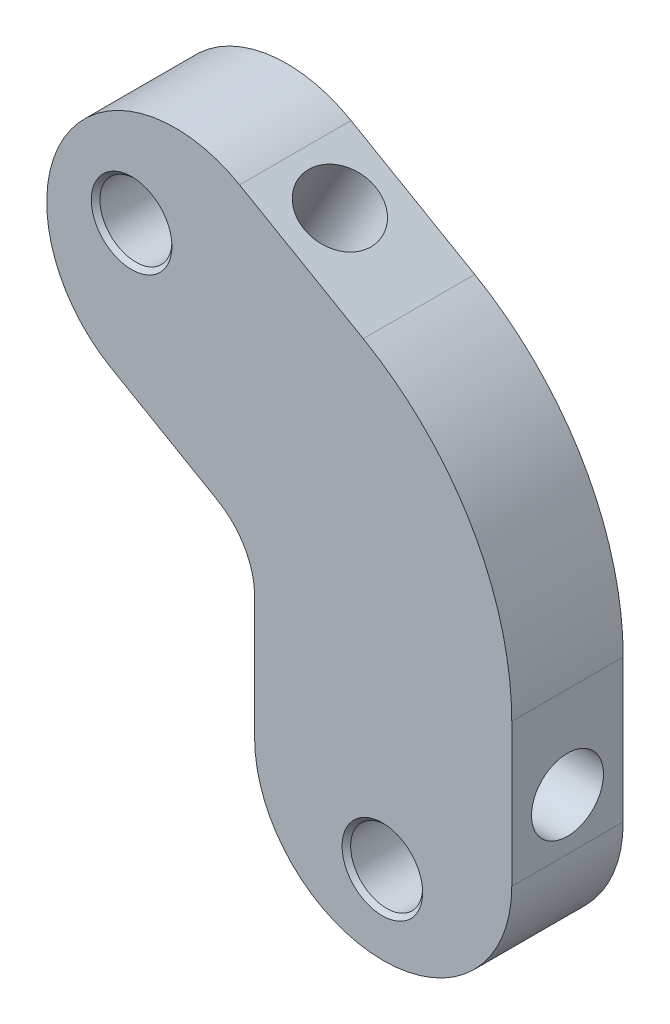
ISO-10303-21;
HEADER;
FILE_DESCRIPTION(('STEP AP214'),'2;1');
FILE_NAME('part.step','',(''),(''),'','','');
FILE_SCHEMA(('AUTOMOTIVE_DESIGN { 1 0 10303 214 1 1 1 1 }'));
ENDSEC;
DATA;
#1=APPLICATION_CONTEXT('core data for automotive mechanical design processes');
#2=APPLICATION_PROTOCOL_DEFINITION('international standard','automotive_design',2000,#1);
#3=PRODUCT_CONTEXT('',#1,'mechanical');
#4=PRODUCT('Part','Part','',(#3));
#5=PRODUCT_RELATED_PRODUCT_CATEGORY('part','',(#4));
#6=PRODUCT_DEFINITION_FORMATION('','',#4);
#7=PRODUCT_DEFINITION_CONTEXT('part definition',#1,'design');
#8=PRODUCT_DEFINITION('design','',#6,#7);
#9=PRODUCT_DEFINITION_SHAPE('','',#8);
#10=(LENGTH_UNIT() NAMED_UNIT(*) SI_UNIT(.MILLI.,.METRE.));
#11=(NAMED_UNIT(*) PLANE_ANGLE_UNIT() SI_UNIT($,.RADIAN.));
#12=(NAMED_UNIT(*) SI_UNIT($,.STERADIAN.) SOLID_ANGLE_UNIT());
#13=UNCERTAINTY_MEASURE_WITH_UNIT(LENGTH_MEASURE(1.E-05),#10,'distance_accuracy_value','');
#14=(GEOMETRIC_REPRESENTATION_CONTEXT(3) GLOBAL_UNCERTAINTY_ASSIGNED_CONTEXT((#13)) GLOBAL_UNIT_ASSIGNED_CONTEXT((#10,
#11,#12)) REPRESENTATION_CONTEXT('',''));
#15=CARTESIAN_POINT('',(0.,0.,0.));
#16=DIRECTION('',(0.,0.,1.));
#17=DIRECTION('',(1.,0.,0.));
#18=AXIS2_PLACEMENT_3D('',#15,#16,#17);
#19=CARTESIAN_POINT('',(-19.6410166168552,-11.3397456934119,13.));
#20=DIRECTION('',(0.,0.,-1.));
#21=DIRECTION('',(-1.,0.,0.));
#22=AXIS2_PLACEMENT_3D('',#19,#20,#21);
#23=CYLINDRICAL_SURFACE('',#22,34.641016151378);
#24=CARTESIAN_POINT('',(-19.6410166168552,-11.3397456934119,0.));
#25=DIRECTION('',(0.,0.,-1.));
#26=DIRECTION('',(-1.,0.,0.));
#27=AXIS2_PLACEMENT_3D('',#24,#25,#26);
#28=CIRCLE('',#27,34.641016151378);
#29=CARTESIAN_POINT('',(-2.320508541166,18.6602543065883,0.));
#30=VERTEX_POINT('',#29);
#31=CARTESIAN_POINT('',(14.999999534523,-11.3397456934118,0.));
#32=VERTEX_POINT('',#31);
#33=EDGE_CURVE('E136',#30,#32,#28,.T.);
#34=ORIENTED_EDGE('',*,*,#33,.F.);
#35=DIRECTION('',(0.,0.,-1.));
#36=VECTOR('',#35,1.);
#37=CARTESIAN_POINT('',(-2.320508541166,18.6602543065883,13.));
#38=LINE('',#37,#36);
#39=CARTESIAN_POINT('',(-2.320508541166,18.6602543065883,13.));
#40=VERTEX_POINT('',#39);
#41=EDGE_CURVE('E53',#40,#30,#38,.T.);
#42=ORIENTED_EDGE('',*,*,#41,.F.);
#43=CARTESIAN_POINT('',(-19.6410166168552,-11.3397456934119,13.));
#44=DIRECTION('',(0.,0.,-1.));
#45=DIRECTION('',(-1.,0.,0.));
#46=AXIS2_PLACEMENT_3D('',#43,#44,#45);
#47=CIRCLE('',#46,34.641016151378);
#48=CARTESIAN_POINT('',(14.999999534523,-11.3397456934118,13.));
#49=VERTEX_POINT('',#48);
#50=EDGE_CURVE('E158',#40,#49,#47,.T.);
#51=ORIENTED_EDGE('',*,*,#50,.T.);
#52=DIRECTION('',(0.,0.,-1.));
#53=VECTOR('',#52,1.);
#54=CARTESIAN_POINT('',(14.999999534523,-11.3397456934118,13.));
#55=LINE('',#54,#53);
#56=EDGE_CURVE('E93',#49,#32,#55,.T.);
#57=ORIENTED_EDGE('',*,*,#56,.T.);
#58=EDGE_LOOP('',(#34,#42,#51,#57));
#59=FACE_BOUND('',#58,.T.);
#60=ADVANCED_FACE('F36',(#59),#23,.T.);
#61=CARTESIAN_POINT('',(-16.7487113059636,26.9903810567669,13.));
#62=DIRECTION('',(0.50000000000001,0.866025403784433,0.));
#63=DIRECTION('',(-0.866025403784433,0.50000000000001,0.));
#64=AXIS2_PLACEMENT_3D('',#61,#62,#63);
#65=PLANE('',#64);
#66=CARTESIAN_POINT('',(-11.5525588832571,23.9903810567668,6.5));
#67=DIRECTION('',(0.50000000000001,0.866025403784433,0.));
#68=DIRECTION('',(-0.866025403784433,0.50000000000001,0.));
#69=AXIS2_PLACEMENT_3D('',#66,#67,#68);
#70=CIRCLE('',#69,4.20000000000004);
#71=CARTESIAN_POINT('',(-7.91525218736241,21.8903810567668,6.5));
#72=VERTEX_POINT('',#71);
#73=EDGE_CURVE('E140',#72,#72,#70,.T.);
#74=ORIENTED_EDGE('',*,*,#73,.F.);
#75=EDGE_LOOP('',(#74));
#76=FACE_BOUND('',#75,.T.);
#77=DIRECTION('',(0.866025403784433,-0.50000000000001,0.));
#78=VECTOR('',#77,1.);
#79=CARTESIAN_POINT('',(-16.7487113059636,26.9903810567669,0.));
#80=LINE('',#79,#78);
#81=CARTESIAN_POINT('',(-16.7487113059636,26.9903810567669,0.));
#82=VERTEX_POINT('',#81);
#83=EDGE_CURVE('E155',#82,#30,#80,.T.);
#84=ORIENTED_EDGE('',*,*,#83,.F.);
#85=DIRECTION('',(0.,0.,-1.));
#86=VECTOR('',#85,1.);
#87=CARTESIAN_POINT('',(-16.7487113059636,26.9903810567669,13.));
#88=LINE('',#87,#86);
#89=CARTESIAN_POINT('',(-16.7487113059636,26.9903810567669,13.));
#90=VERTEX_POINT('',#89);
#91=EDGE_CURVE('E81',#90,#82,#88,.T.);
#92=ORIENTED_EDGE('',*,*,#91,.F.);
#93=DIRECTION('',(0.866025403784433,-0.50000000000001,0.));
#94=VECTOR('',#93,1.);
#95=CARTESIAN_POINT('',(-16.7487113059636,26.9903810567669,13.));
#96=LINE('',#95,#94);
#97=EDGE_CURVE('E126',#90,#40,#96,.T.);
#98=ORIENTED_EDGE('',*,*,#97,.T.);
#99=ORIENTED_EDGE('',*,*,#41,.T.);
#100=EDGE_LOOP('',(#84,#92,#98,#99));
#101=FACE_BOUND('',#100,.T.);
#102=ADVANCED_FACE('F200',(#76,#101),#65,.T.);
#103=CARTESIAN_POINT('',(-24.2487113059643,14.,13.));
#104=DIRECTION('',(0.,0.,-1.));
#105=DIRECTION('',(-1.,0.,0.));
#106=AXIS2_PLACEMENT_3D('',#103,#104,#105);
#107=CYLINDRICAL_SURFACE('',#106,15.0000000000002);
#108=CARTESIAN_POINT('',(-24.2487113059643,14.,0.));
#109=DIRECTION('',(0.,0.,-1.));
#110=DIRECTION('',(-1.,0.,0.));
#111=AXIS2_PLACEMENT_3D('',#108,#109,#110);
#112=CIRCLE('',#111,15.0000000000002);
#113=CARTESIAN_POINT('',(-31.7487113059639,1.00961894323333,0.));
#114=VERTEX_POINT('',#113);
#115=EDGE_CURVE('E112',#114,#82,#112,.T.);
#116=ORIENTED_EDGE('',*,*,#115,.F.);
#117=DIRECTION('',(0.,0.,-1.));
#118=VECTOR('',#117,1.);
#119=CARTESIAN_POINT('',(-31.7487113059639,1.00961894323333,13.));
#120=LINE('',#119,#118);
#121=CARTESIAN_POINT('',(-31.7487113059639,1.00961894323333,13.));
#122=VERTEX_POINT('',#121);
#123=EDGE_CURVE('E108',#122,#114,#120,.T.);
#124=ORIENTED_EDGE('',*,*,#123,.F.);
#125=CARTESIAN_POINT('',(-24.2487113059643,14.,13.));
#126=DIRECTION('',(0.,0.,-1.));
#127=DIRECTION('',(-1.,0.,0.));
#128=AXIS2_PLACEMENT_3D('',#125,#126,#127);
#129=CIRCLE('',#128,14.9999999999998);
#130=EDGE_CURVE('E111',#122,#90,#129,.T.);
#131=ORIENTED_EDGE('',*,*,#130,.T.);
#132=ORIENTED_EDGE('',*,*,#91,.T.);
#133=EDGE_LOOP('',(#116,#124,#131,#132));
#134=FACE_BOUND('',#133,.T.);
#135=ADVANCED_FACE('F110',(#134),#107,.T.);
#136=CARTESIAN_POINT('',(-19.3301274843993,-6.16025376910026,13.));
#137=DIRECTION('',(-0.499999999999976,-0.866025403784452,0.));
#138=DIRECTION('',(0.866025403784453,-0.499999999999976,0.));
#139=AXIS2_PLACEMENT_3D('',#136,#137,#138);
#140=PLANE('',#139);
#141=CARTESIAN_POINT('',(-26.5525588832568,-1.99038105676587,6.5));
#142=DIRECTION('',(-0.5,-0.866025403784439,0.));
#143=DIRECTION('',(0.866025403784439,-0.5,0.));
#144=AXIS2_PLACEMENT_3D('',#141,#142,#143);
#145=CIRCLE('',#144,4.20000000000004);
#146=CARTESIAN_POINT('',(-22.9152521873621,-4.09038105676589,6.5));
#147=VERTEX_POINT('',#146);
#148=EDGE_CURVE('E280',#147,#147,#145,.T.);
#149=ORIENTED_EDGE('',*,*,#148,.F.);
#150=EDGE_LOOP('',(#149));
#151=FACE_BOUND('',#150,.T.);
#152=DIRECTION('',(-0.866025403784453,0.499999999999976,0.));
#153=VECTOR('',#152,1.);
#154=CARTESIAN_POINT('',(-19.3301274843993,-6.16025376910026,0.));
#155=LINE('',#154,#153);
#156=CARTESIAN_POINT('',(-19.3301274843993,-6.16025376910026,0.));
#157=VERTEX_POINT('',#156);
#158=EDGE_CURVE('E152',#157,#114,#155,.T.);
#159=ORIENTED_EDGE('',*,*,#158,.F.);
#160=DIRECTION('',(0.,0.,-1.));
#161=VECTOR('',#160,1.);
#162=CARTESIAN_POINT('',(-19.3301274843993,-6.16025376910026,13.));
#163=LINE('',#162,#161);
#164=CARTESIAN_POINT('',(-19.3301274843993,-6.16025376910026,13.));
#165=VERTEX_POINT('',#164);
#166=EDGE_CURVE('E117',#165,#157,#163,.T.);
#167=ORIENTED_EDGE('',*,*,#166,.F.);
#168=DIRECTION('',(-0.866025403784453,0.499999999999976,0.));
#169=VECTOR('',#168,1.);
#170=CARTESIAN_POINT('',(-19.3301274843993,-6.16025376910026,13.));
#171=LINE('',#170,#169);
#172=EDGE_CURVE('E124',#165,#122,#171,.T.);
#173=ORIENTED_EDGE('',*,*,#172,.T.);
#174=ORIENTED_EDGE('',*,*,#123,.T.);
#175=EDGE_LOOP('',(#159,#167,#173,#174));
#176=FACE_BOUND('',#175,.T.);
#177=ADVANCED_FACE('F128',(#151,#176),#140,.T.);
#178=CARTESIAN_POINT('',(-23.6602545033221,-13.6602537691008,13.));
#179=DIRECTION('',(0.,0.,-1.));
#180=DIRECTION('',(-1.,0.,0.));
#181=AXIS2_PLACEMENT_3D('',#178,#179,#180);
#182=CYLINDRICAL_SURFACE('',#181,8.66025403784512);
#183=CARTESIAN_POINT('',(-23.6602545033221,-13.6602537691008,0.));
#184=DIRECTION('',(0.,0.,1.));
#185=DIRECTION('',(1.,0.,0.));
#186=AXIS2_PLACEMENT_3D('',#183,#184,#185);
#187=CIRCLE('',#186,8.66025403784512);
#188=CARTESIAN_POINT('',(-15.000000465477,-13.6602537691003,0.));
#189=VERTEX_POINT('',#188);
#190=EDGE_CURVE('E149',#189,#157,#187,.T.);
#191=ORIENTED_EDGE('',*,*,#190,.F.);
#192=DIRECTION('',(0.,0.,-1.));
#193=VECTOR('',#192,1.);
#194=CARTESIAN_POINT('',(-15.000000465477,-13.6602537691003,13.));
#195=LINE('',#194,#193);
#196=CARTESIAN_POINT('',(-15.000000465477,-13.6602537691003,13.));
#197=VERTEX_POINT('',#196);
#198=EDGE_CURVE('E163',#197,#189,#195,.T.);
#199=ORIENTED_EDGE('',*,*,#198,.F.);
#200=CARTESIAN_POINT('',(-23.6602545033221,-13.6602537691008,13.));
#201=DIRECTION('',(0.,0.,1.));
#202=DIRECTION('',(1.,0.,0.));
#203=AXIS2_PLACEMENT_3D('',#200,#201,#202);
#204=CIRCLE('',#203,8.66025403784512);
#205=EDGE_CURVE('E129',#197,#165,#204,.T.);
#206=ORIENTED_EDGE('',*,*,#205,.T.);
#207=ORIENTED_EDGE('',*,*,#166,.T.);
#208=EDGE_LOOP('',(#191,#199,#206,#207));
#209=FACE_BOUND('',#208,.T.);
#210=ADVANCED_FACE('F251',(#209),#182,.F.);
#211=CARTESIAN_POINT('',(-15.0000004654777,-27.9999997312565,13.));
#212=DIRECTION('',(-1.,0.,0.));
#213=DIRECTION('',(0.,-1.,0.));
#214=AXIS2_PLACEMENT_3D('',#211,#212,#213);
#215=PLANE('',#214);
#216=CARTESIAN_POINT('',(-15.0000004654764,-21.9999999999993,6.5));
#217=DIRECTION('',(-1.,0.,0.));
#218=DIRECTION('',(0.,-1.,0.));
#219=AXIS2_PLACEMENT_3D('',#216,#217,#218);
#220=CIRCLE('',#219,4.19999999999998);
#221=CARTESIAN_POINT('',(-15.0000004654764,-26.1999999999993,6.5));
#222=VERTEX_POINT('',#221);
#223=EDGE_CURVE('E284',#222,#222,#220,.T.);
#224=ORIENTED_EDGE('',*,*,#223,.F.);
#225=EDGE_LOOP('',(#224));
#226=FACE_BOUND('',#225,.T.);
#227=DIRECTION('',(0.,1.,0.));
#228=VECTOR('',#227,1.);
#229=CARTESIAN_POINT('',(-15.0000004654777,-27.9999997312565,0.));
#230=LINE('',#229,#228);
#231=CARTESIAN_POINT('',(-15.0000004654777,-27.9999997312565,0.));
#232=VERTEX_POINT('',#231);
#233=EDGE_CURVE('E146',#232,#189,#230,.T.);
#234=ORIENTED_EDGE('',*,*,#233,.F.);
#235=DIRECTION('',(0.,0.,-1.));
#236=VECTOR('',#235,1.);
#237=CARTESIAN_POINT('',(-15.0000004654777,-27.9999997312565,13.));
#238=LINE('',#237,#236);
#239=CARTESIAN_POINT('',(-15.0000004654777,-27.9999997312565,13.));
#240=VERTEX_POINT('',#239);
#241=EDGE_CURVE('E165',#240,#232,#238,.T.);
#242=ORIENTED_EDGE('',*,*,#241,.F.);
#243=DIRECTION('',(0.,1.,0.));
#244=VECTOR('',#243,1.);
#245=CARTESIAN_POINT('',(-15.0000004654777,-27.9999997312565,13.));
#246=LINE('',#245,#244);
#247=EDGE_CURVE('E131',#240,#197,#246,.T.);
#248=ORIENTED_EDGE('',*,*,#247,.T.);
#249=ORIENTED_EDGE('',*,*,#198,.T.);
#250=EDGE_LOOP('',(#234,#242,#248,#249));
#251=FACE_BOUND('',#250,.T.);
#252=ADVANCED_FACE('F255',(#226,#251),#215,.T.);
#253=CARTESIAN_POINT('',(-4.65477687807613E-07,-27.9999997312565,13.));
#254=DIRECTION('',(0.,0.,-1.));
#255=DIRECTION('',(-1.,0.,0.));
#256=AXIS2_PLACEMENT_3D('',#253,#254,#255);
#257=CYLINDRICAL_SURFACE('',#256,15.);
#258=CARTESIAN_POINT('',(-4.65477687807613E-07,-27.9999997312565,0.));
#259=DIRECTION('',(0.,0.,-1.));
#260=DIRECTION('',(-1.,0.,0.));
#261=AXIS2_PLACEMENT_3D('',#258,#259,#260);
#262=CIRCLE('',#261,15.);
#263=CARTESIAN_POINT('',(14.9999995345223,-27.9999997312565,0.));
#264=VERTEX_POINT('',#263);
#265=EDGE_CURVE('E143',#264,#232,#262,.T.);
#266=ORIENTED_EDGE('',*,*,#265,.F.);
#267=DIRECTION('',(0.,0.,-1.));
#268=VECTOR('',#267,1.);
#269=CARTESIAN_POINT('',(14.9999995345223,-27.9999997312565,13.));
#270=LINE('',#269,#268);
#271=CARTESIAN_POINT('',(14.9999995345223,-27.9999997312565,13.));
#272=VERTEX_POINT('',#271);
#273=EDGE_CURVE('E167',#272,#264,#270,.T.);
#274=ORIENTED_EDGE('',*,*,#273,.F.);
#275=CARTESIAN_POINT('',(-4.65477687807613E-07,-27.9999997312565,13.));
#276=DIRECTION('',(0.,0.,-1.));
#277=DIRECTION('',(-1.,0.,0.));
#278=AXIS2_PLACEMENT_3D('',#275,#276,#277);
#279=CIRCLE('',#278,15.);
#280=EDGE_CURVE('E269',#272,#240,#279,.T.);
#281=ORIENTED_EDGE('',*,*,#280,.T.);
#282=ORIENTED_EDGE('',*,*,#241,.T.);
#283=EDGE_LOOP('',(#266,#274,#281,#282));
#284=FACE_BOUND('',#283,.T.);
#285=ADVANCED_FACE('F242',(#284),#257,.T.);
#286=CARTESIAN_POINT('',(14.999999534523,-11.3397456934118,13.));
#287=DIRECTION('',(1.,0.,0.));
#288=DIRECTION('',(0.,1.,0.));
#289=AXIS2_PLACEMENT_3D('',#286,#287,#288);
#290=PLANE('',#289);
#291=CARTESIAN_POINT('',(14.999999534523,-21.9999999999993,6.5));
#292=DIRECTION('',(-1.,0.,0.));
#293=DIRECTION('',(0.,-1.,0.));
#294=AXIS2_PLACEMENT_3D('',#291,#292,#293);
#295=CIRCLE('',#294,4.19999999999998);
#296=CARTESIAN_POINT('',(14.999999534523,-26.1999999999993,6.5));
#297=VERTEX_POINT('',#296);
#298=EDGE_CURVE('E283',#297,#297,#295,.T.);
#299=ORIENTED_EDGE('',*,*,#298,.T.);
#300=EDGE_LOOP('',(#299));
#301=FACE_BOUND('',#300,.T.);
#302=DIRECTION('',(0.,-1.,0.));
#303=VECTOR('',#302,1.);
#304=CARTESIAN_POINT('',(14.999999534523,-11.3397456934118,0.));
#305=LINE('',#304,#303);
#306=EDGE_CURVE('E139',#32,#264,#305,.T.);
#307=ORIENTED_EDGE('',*,*,#306,.F.);
#308=ORIENTED_EDGE('',*,*,#56,.F.);
#309=DIRECTION('',(0.,-1.,0.));
#310=VECTOR('',#309,1.);
#311=CARTESIAN_POINT('',(14.999999534523,-11.3397456934118,13.));
#312=LINE('',#311,#310);
#313=EDGE_CURVE('E268',#49,#272,#312,.T.);
#314=ORIENTED_EDGE('',*,*,#313,.T.);
#315=ORIENTED_EDGE('',*,*,#273,.T.);
#316=EDGE_LOOP('',(#307,#308,#314,#315));
#317=FACE_BOUND('',#316,.T.);
#318=ADVANCED_FACE('F209',(#301,#317),#290,.T.);
#319=CARTESIAN_POINT('',(-19.6410166168552,-11.3397456934119,13.));
#320=DIRECTION('',(0.,0.,-1.));
#321=DIRECTION('',(-1.,0.,0.));
#322=AXIS2_PLACEMENT_3D('',#319,#320,#321);
#323=PLANE('',#322);
#324=CARTESIAN_POINT('',(-29.3474320970751,16.8312434638099,13.));
#325=DIRECTION('',(0.,0.,-1.));
#326=DIRECTION('',(-1.,0.,0.));
#327=AXIS2_PLACEMENT_3D('',#324,#325,#326);
#328=CIRCLE('',#327,4.69999999999999);
#329=CARTESIAN_POINT('',(-34.0474320970751,16.8312434638099,13.));
#330=VERTEX_POINT('',#329);
#331=EDGE_CURVE('E11',#330,#330,#328,.T.);
#332=ORIENTED_EDGE('',*,*,#331,.T.);
#333=EDGE_LOOP('',(#332));
#334=FACE_BOUND('',#333,.T.);
#335=CARTESIAN_POINT('',(-0.0974320970731666,-33.8312426575786,13.));
#336=DIRECTION('',(0.,0.,-1.));
#337=DIRECTION('',(-1.,0.,0.));
#338=AXIS2_PLACEMENT_3D('',#335,#336,#337);
#339=CIRCLE('',#338,4.69999999999998);
#340=CARTESIAN_POINT('',(-4.79743209707315,-33.8312426575786,13.));
#341=VERTEX_POINT('',#340);
#342=EDGE_CURVE('E45',#341,#341,#339,.T.);
#343=ORIENTED_EDGE('',*,*,#342,.T.);
#344=EDGE_LOOP('',(#343));
#345=FACE_BOUND('',#344,.T.);
#346=ORIENTED_EDGE('',*,*,#50,.F.);
#347=ORIENTED_EDGE('',*,*,#97,.F.);
#348=ORIENTED_EDGE('',*,*,#130,.F.);
#349=ORIENTED_EDGE('',*,*,#172,.F.);
#350=ORIENTED_EDGE('',*,*,#205,.F.);
#351=ORIENTED_EDGE('',*,*,#247,.F.);
#352=ORIENTED_EDGE('',*,*,#280,.F.);
#353=ORIENTED_EDGE('',*,*,#313,.F.);
#354=EDGE_LOOP('',(#346,#347,#348,#349,#350,#351,#352,#353));
#355=FACE_BOUND('',#354,.T.);
#356=ADVANCED_FACE('F122',(#334,#345,#355),#323,.F.);
#357=CARTESIAN_POINT('',(-19.6410166168552,-11.3397456934119,0.));
#358=DIRECTION('',(0.,0.,-1.));
#359=DIRECTION('',(-1.,0.,0.));
#360=AXIS2_PLACEMENT_3D('',#357,#358,#359);
#361=PLANE('',#360);
#362=CARTESIAN_POINT('',(-0.0974320970731666,-33.8312426575786,0.));
#363=DIRECTION('',(0.,0.,-1.));
#364=DIRECTION('',(-1.,0.,0.));
#365=AXIS2_PLACEMENT_3D('',#362,#363,#364);
#366=CIRCLE('',#365,4.7);
#367=CARTESIAN_POINT('',(-4.79743209707316,-33.8312426575786,0.));
#368=VERTEX_POINT('',#367);
#369=EDGE_CURVE('E178',#368,#368,#366,.F.);
#370=ORIENTED_EDGE('',*,*,#369,.T.);
#371=EDGE_LOOP('',(#370));
#372=FACE_BOUND('',#371,.T.);
#373=CARTESIAN_POINT('',(-29.3474320970751,16.8312434638099,0.));
#374=DIRECTION('',(0.,0.,-1.));
#375=DIRECTION('',(-1.,0.,0.));
#376=AXIS2_PLACEMENT_3D('',#373,#374,#375);
#377=CIRCLE('',#376,4.7);
#378=CARTESIAN_POINT('',(-34.0474320970751,16.8312434638099,0.));
#379=VERTEX_POINT('',#378);
#380=EDGE_CURVE('E175',#379,#379,#377,.F.);
#381=ORIENTED_EDGE('',*,*,#380,.T.);
#382=EDGE_LOOP('',(#381));
#383=FACE_BOUND('',#382,.T.);
#384=ORIENTED_EDGE('',*,*,#33,.T.);
#385=ORIENTED_EDGE('',*,*,#306,.T.);
#386=ORIENTED_EDGE('',*,*,#265,.T.);
#387=ORIENTED_EDGE('',*,*,#233,.T.);
#388=ORIENTED_EDGE('',*,*,#190,.T.);
#389=ORIENTED_EDGE('',*,*,#158,.T.);
#390=ORIENTED_EDGE('',*,*,#115,.T.);
#391=ORIENTED_EDGE('',*,*,#83,.T.);
#392=EDGE_LOOP('',(#384,#385,#386,#387,#388,#389,#390,#391));
#393=FACE_BOUND('',#392,.T.);
#394=ADVANCED_FACE('F233',(#372,#383,#393),#361,.T.);
#395=CARTESIAN_POINT('',(-2.74519064475215,39.2451903268258,6.5));
#396=DIRECTION('',(-0.5,-0.866025403784439,0.));
#397=DIRECTION('',(0.866025403784439,-0.5,0.));
#398=AXIS2_PLACEMENT_3D('',#395,#396,#397);
#399=CYLINDRICAL_SURFACE('',#398,4.20000000000004);
#400=CARTESIAN_POINT('',(-7.91525218736241,21.8903810567668,6.5));
#401=CARTESIAN_POINT('',(-8.0715021873624,21.6197481180841,6.5));
#402=CARTESIAN_POINT('',(-8.2277521873624,21.3491151794015,6.5));
#403=CARTESIAN_POINT('',(-8.54025218736239,20.8078493020362,6.5));
#404=CARTESIAN_POINT('',(-8.69650218736239,20.5372163633536,6.5));
#405=CARTESIAN_POINT('',(-9.00900218736238,19.9959504859884,6.5));
#406=CARTESIAN_POINT('',(-9.16525218736238,19.7253175473057,6.5));
#407=CARTESIAN_POINT('',(-9.47775218736238,19.1840516699405,6.5));
#408=CARTESIAN_POINT('',(-9.63400218736238,18.9134187312578,6.5));
#409=CARTESIAN_POINT('',(-9.94650218736237,18.3721528538926,6.5));
#410=CARTESIAN_POINT('',(-10.1027521873624,18.1015199152099,6.5));
#411=CARTESIAN_POINT('',(-10.4152521873624,17.5602540378447,6.5));
#412=CARTESIAN_POINT('',(-10.5715021873624,17.289621099162,6.5));
#413=CARTESIAN_POINT('',(-10.8840021873623,16.7483552217968,6.5));
#414=CARTESIAN_POINT('',(-11.0402521873623,16.4777222831141,6.5));
#415=CARTESIAN_POINT('',(-11.3527521873623,15.9364564057489,6.5));
#416=CARTESIAN_POINT('',(-11.5090021873623,15.6658234670662,6.5));
#417=CARTESIAN_POINT('',(-11.8215021873623,15.124557589701,6.5));
#418=CARTESIAN_POINT('',(-11.9777521873623,14.8539246510183,6.5));
#419=CARTESIAN_POINT('',(-12.2902521873623,14.3126587736531,6.5));
#420=CARTESIAN_POINT('',(-12.4465021873623,14.0420258349704,6.5));
#421=CARTESIAN_POINT('',(-12.7590021873623,13.5007599576052,6.5));
#422=CARTESIAN_POINT('',(-12.9152521873623,13.2301270189226,6.5));
#423=CARTESIAN_POINT('',(-13.2277521873623,12.6888611415573,6.5));
#424=CARTESIAN_POINT('',(-13.3840021873623,12.4182282028747,6.5));
#425=CARTESIAN_POINT('',(-13.6965021873623,11.8769623255094,6.5));
#426=CARTESIAN_POINT('',(-13.8527521873623,11.6063293868268,6.5));
#427=CARTESIAN_POINT('',(-14.1652521873623,11.0650635094615,6.5));
#428=CARTESIAN_POINT('',(-14.3215021873623,10.7944305707789,6.5));
#429=CARTESIAN_POINT('',(-14.6340021873623,10.2531646934136,6.5));
#430=CARTESIAN_POINT('',(-14.7902521873623,9.98253175473097,6.5));
#431=CARTESIAN_POINT('',(-15.1027521873623,9.4412658773657,6.5));
#432=CARTESIAN_POINT('',(-15.2590021873623,9.17063293868307,6.5));
#433=CARTESIAN_POINT('',(-15.5715021873623,8.62936706131781,6.5));
#434=CARTESIAN_POINT('',(-15.7277521873623,8.35873412263518,6.5));
#435=CARTESIAN_POINT('',(-16.0402521873622,7.81746824526991,6.5));
#436=CARTESIAN_POINT('',(-16.1965021873622,7.54683530658728,6.5));
#437=CARTESIAN_POINT('',(-16.5090021873622,7.00556942922202,6.5));
#438=CARTESIAN_POINT('',(-16.6652521873622,6.73493649053938,6.5));
#439=CARTESIAN_POINT('',(-16.9777521873622,6.19367061317412,6.5));
#440=CARTESIAN_POINT('',(-17.1340021873622,5.92303767449149,6.5));
#441=CARTESIAN_POINT('',(-17.4465021873622,5.38177179712623,6.5));
#442=CARTESIAN_POINT('',(-17.6027521873622,5.11113885844359,6.5));
#443=CARTESIAN_POINT('',(-17.9152521873622,4.56987298107833,6.5));
#444=CARTESIAN_POINT('',(-18.0715021873622,4.2992400423957,6.5));
#445=CARTESIAN_POINT('',(-18.3840021873622,3.75797416503044,6.5));
#446=CARTESIAN_POINT('',(-18.5402521873622,3.4873412263478,6.5));
#447=CARTESIAN_POINT('',(-18.8527521873622,2.94607534898254,6.5));
#448=CARTESIAN_POINT('',(-19.0090021873622,2.67544241029991,6.5));
#449=CARTESIAN_POINT('',(-19.3215021873622,2.13417653293464,6.5));
#450=CARTESIAN_POINT('',(-19.4777521873622,1.86354359425201,6.5));
#451=CARTESIAN_POINT('',(-19.7902521873622,1.32227771688674,6.5));
#452=CARTESIAN_POINT('',(-19.9465021873622,1.05164477820411,6.5));
#453=CARTESIAN_POINT('',(-20.2590021873622,0.510378900838847,6.5));
#454=CARTESIAN_POINT('',(-20.4152521873622,0.239745962156215,6.5));
#455=CARTESIAN_POINT('',(-20.7277521873622,-0.301519915209048,6.5));
#456=CARTESIAN_POINT('',(-20.8840021873622,-0.572152853891679,6.5));
#457=CARTESIAN_POINT('',(-21.1965021873621,-1.11341873125694,6.5));
#458=CARTESIAN_POINT('',(-21.3527521873621,-1.38405166993958,6.5));
#459=CARTESIAN_POINT('',(-21.6652521873621,-1.92531754730484,6.5));
#460=CARTESIAN_POINT('',(-21.8215021873621,-2.19595048598747,6.5));
#461=CARTESIAN_POINT('',(-22.1340021873621,-2.73721636335274,6.5));
#462=CARTESIAN_POINT('',(-22.2902521873621,-3.00784930203537,6.5));
#463=CARTESIAN_POINT('',(-22.6027521873621,-3.54911517940063,6.5));
#464=CARTESIAN_POINT('',(-22.7590021873621,-3.81974811808326,6.5));
#465=CARTESIAN_POINT('',(-22.9152521873621,-4.09038105676589,6.5));
#466=B_SPLINE_CURVE_WITH_KNOTS('',3,(#400,#401,#402,#403,#404,#405,#406,#407,#408,#409,#410,
#411,#412,#413,#414,#415,#416,#417,#418,#419,#420,#421,#422,#423,#424,#425,#426,#427,#428,#429,
#430,#431,#432,#433,#434,#435,#436,#437,#438,#439,#440,#441,#442,#443,#444,#445,#446,#447,#448,
#449,#450,#451,#452,#453,#454,#455,#456,#457,#458,#459,#460,#461,#462,#463,#464,#465),
.UNSPECIFIED.,.F.,.F.,(4,2,2,2,2,2,2,2,2,2,2,2,2,2,2,2,2,2,2,2,2,2,2,2,2,2,2,2,2,2,2,2,4),(0.,
0.937499999999983,1.87499999999996,2.81249999999994,3.74999999999993,4.68749999999991,
5.62499999999989,6.56249999999987,7.49999999999986,8.43749999999984,9.37499999999982,
10.3124999999998,11.2499999999998,12.1874999999998,13.1249999999997,14.0624999999997,
14.9999999999997,15.9374999999997,16.8749999999997,17.8124999999997,18.7499999999996,
19.6874999999996,20.6249999999996,21.5624999999996,22.4999999999996,23.4374999999996,
24.3749999999995,25.3124999999995,26.2499999999995,27.1874999999995,28.1249999999995,
29.0624999999994,29.9999999999994),.UNSPECIFIED.);
#467=EDGE_CURVE('BSEAM239',#72,#147,#466,.T.);
#468=ORIENTED_EDGE('',*,*,#73,.T.);
#469=ORIENTED_EDGE('',*,*,#148,.T.);
#470=ORIENTED_EDGE('',*,*,#467,.T.);
#471=ORIENTED_EDGE('',*,*,#467,.F.);
#472=EDGE_LOOP('',(#468,#470,#469,#471));
#473=FACE_BOUND('',#472,.T.);
#474=ADVANCED_FACE('F239',(#473),#399,.F.);
#475=CARTESIAN_POINT('',(14.999999534523,-21.9999999999993,6.5));
#476=DIRECTION('',(-1.,0.,0.));
#477=DIRECTION('',(0.,-1.,0.));
#478=AXIS2_PLACEMENT_3D('',#475,#476,#477);
#479=CYLINDRICAL_SURFACE('',#478,4.19999999999998);
#480=CARTESIAN_POINT('',(-15.0000004654764,-26.1999999999993,6.5));
#481=CARTESIAN_POINT('',(-14.6875004654764,-26.1999999999993,6.5));
#482=CARTESIAN_POINT('',(-14.3750004654764,-26.1999999999993,6.5));
#483=CARTESIAN_POINT('',(-13.7500004654764,-26.1999999999993,6.5));
#484=CARTESIAN_POINT('',(-13.4375004654764,-26.1999999999993,6.5));
#485=CARTESIAN_POINT('',(-12.8125004654765,-26.1999999999993,6.5));
#486=CARTESIAN_POINT('',(-12.5000004654765,-26.1999999999993,6.5));
#487=CARTESIAN_POINT('',(-11.8750004654765,-26.1999999999993,6.5));
#488=CARTESIAN_POINT('',(-11.5625004654765,-26.1999999999993,6.5));
#489=CARTESIAN_POINT('',(-10.9375004654765,-26.1999999999993,6.5));
#490=CARTESIAN_POINT('',(-10.6250004654765,-26.1999999999993,6.5));
#491=CARTESIAN_POINT('',(-10.0000004654765,-26.1999999999993,6.5));
#492=CARTESIAN_POINT('',(-9.68750046547652,-26.1999999999993,6.5));
#493=CARTESIAN_POINT('',(-9.06250046547654,-26.1999999999993,6.5));
#494=CARTESIAN_POINT('',(-8.75000046547654,-26.1999999999993,6.5));
#495=CARTESIAN_POINT('',(-8.12500046547656,-26.1999999999993,6.5));
#496=CARTESIAN_POINT('',(-7.81250046547656,-26.1999999999993,6.5));
#497=CARTESIAN_POINT('',(-7.18750046547657,-26.1999999999993,6.5));
#498=CARTESIAN_POINT('',(-6.87500046547658,-26.1999999999993,6.5));
#499=CARTESIAN_POINT('',(-6.25000046547659,-26.1999999999993,6.5));
#500=CARTESIAN_POINT('',(-5.9375004654766,-26.1999999999993,6.5));
#501=CARTESIAN_POINT('',(-5.31250046547661,-26.1999999999993,6.5));
#502=CARTESIAN_POINT('',(-5.00000046547662,-26.1999999999993,6.5));
#503=CARTESIAN_POINT('',(-4.37500046547663,-26.1999999999993,6.5));
#504=CARTESIAN_POINT('',(-4.06250046547664,-26.1999999999993,6.5));
#505=CARTESIAN_POINT('',(-3.43750046547665,-26.1999999999993,6.5));
#506=CARTESIAN_POINT('',(-3.12500046547666,-26.1999999999993,6.5));
#507=CARTESIAN_POINT('',(-2.50000046547667,-26.1999999999993,6.5));
#508=CARTESIAN_POINT('',(-2.18750046547668,-26.1999999999993,6.5));
#509=CARTESIAN_POINT('',(-1.56250046547669,-26.1999999999993,6.5));
#510=CARTESIAN_POINT('',(-1.2500004654767,-26.1999999999993,6.5));
#511=CARTESIAN_POINT('',(-0.625000465476711,-26.1999999999993,6.5));
#512=CARTESIAN_POINT('',(-0.312500465476718,-26.1999999999993,6.5));
#513=CARTESIAN_POINT('',(0.312499534523268,-26.1999999999993,6.5));
#514=CARTESIAN_POINT('',(0.624999534523262,-26.1999999999993,6.5));
#515=CARTESIAN_POINT('',(1.24999953452325,-26.1999999999993,6.5));
#516=CARTESIAN_POINT('',(1.56249953452324,-26.1999999999993,6.5));
#517=CARTESIAN_POINT('',(2.18749953452323,-26.1999999999993,6.5));
#518=CARTESIAN_POINT('',(2.49999953452322,-26.1999999999993,6.5));
#519=CARTESIAN_POINT('',(3.12499953452321,-26.1999999999993,6.5));
#520=CARTESIAN_POINT('',(3.43749953452321,-26.1999999999993,6.5));
#521=CARTESIAN_POINT('',(4.06249953452319,-26.1999999999993,6.5));
#522=CARTESIAN_POINT('',(4.37499953452319,-26.1999999999993,6.5));
#523=CARTESIAN_POINT('',(4.99999953452317,-26.1999999999993,6.5));
#524=CARTESIAN_POINT('',(5.31249953452317,-26.1999999999993,6.5));
#525=CARTESIAN_POINT('',(5.93749953452315,-26.1999999999993,6.5));
#526=CARTESIAN_POINT('',(6.24999953452315,-26.1999999999993,6.5));
#527=CARTESIAN_POINT('',(6.87499953452313,-26.1999999999993,6.5));
#528=CARTESIAN_POINT('',(7.18749953452312,-26.1999999999993,6.5));
#529=CARTESIAN_POINT('',(7.81249953452311,-26.1999999999993,6.5));
#530=CARTESIAN_POINT('',(8.12499953452311,-26.1999999999993,6.5));
#531=CARTESIAN_POINT('',(8.74999953452309,-26.1999999999993,6.5));
#532=CARTESIAN_POINT('',(9.06249953452309,-26.1999999999993,6.5));
#533=CARTESIAN_POINT('',(9.68749953452307,-26.1999999999993,6.5));
#534=CARTESIAN_POINT('',(9.99999953452307,-26.1999999999993,6.5));
#535=CARTESIAN_POINT('',(10.6249995345231,-26.1999999999993,6.5));
#536=CARTESIAN_POINT('',(10.937499534523,-26.1999999999993,6.5));
#537=CARTESIAN_POINT('',(11.562499534523,-26.1999999999993,6.5));
#538=CARTESIAN_POINT('',(11.874999534523,-26.1999999999993,6.5));
#539=CARTESIAN_POINT('',(12.499999534523,-26.1999999999993,6.5));
#540=CARTESIAN_POINT('',(12.812499534523,-26.1999999999993,6.5));
#541=CARTESIAN_POINT('',(13.437499534523,-26.1999999999993,6.5));
#542=CARTESIAN_POINT('',(13.749999534523,-26.1999999999993,6.5));
#543=CARTESIAN_POINT('',(14.374999534523,-26.1999999999993,6.5));
#544=CARTESIAN_POINT('',(14.687499534523,-26.1999999999993,6.5));
#545=CARTESIAN_POINT('',(14.999999534523,-26.1999999999993,6.5));
#546=B_SPLINE_CURVE_WITH_KNOTS('',3,(#480,#481,#482,#483,#484,#485,#486,#487,#488,#489,#490,
#491,#492,#493,#494,#495,#496,#497,#498,#499,#500,#501,#502,#503,#504,#505,#506,#507,#508,#509,
#510,#511,#512,#513,#514,#515,#516,#517,#518,#519,#520,#521,#522,#523,#524,#525,#526,#527,#528,
#529,#530,#531,#532,#533,#534,#535,#536,#537,#538,#539,#540,#541,#542,#543,#544,#545),
.UNSPECIFIED.,.F.,.F.,(4,2,2,2,2,2,2,2,2,2,2,2,2,2,2,2,2,2,2,2,2,2,2,2,2,2,2,2,2,2,2,2,4),(0.,
0.93749999999998,1.87499999999996,2.81249999999994,3.74999999999992,4.6874999999999,
5.62499999999988,6.56249999999986,7.49999999999985,8.43749999999983,9.37499999999981,
10.3124999999998,11.2499999999998,12.1874999999997,13.1249999999997,14.0624999999997,
14.9999999999997,15.9374999999997,16.8749999999996,17.8124999999996,18.7499999999996,
19.6874999999996,20.6249999999996,21.5624999999996,22.4999999999995,23.4374999999995,
24.3749999999995,25.3124999999995,26.2499999999995,27.1874999999994,28.1249999999994,
29.0624999999994,29.9999999999994),.UNSPECIFIED.);
#547=EDGE_CURVE('BSEAM290',#222,#297,#546,.T.);
#548=ORIENTED_EDGE('',*,*,#223,.T.);
#549=ORIENTED_EDGE('',*,*,#298,.F.);
#550=ORIENTED_EDGE('',*,*,#547,.T.);
#551=ORIENTED_EDGE('',*,*,#547,.F.);
#552=EDGE_LOOP('',(#548,#550,#549,#551));
#553=FACE_BOUND('',#552,.T.);
#554=ADVANCED_FACE('F290',(#553),#479,.F.);
#555=CARTESIAN_POINT('',(-0.0974320970731666,-33.8312426575786,0.));
#556=DIRECTION('',(0.,0.,-1.));
#557=DIRECTION('',(0.,1.,0.));
#558=AXIS2_PLACEMENT_3D('',#555,#556,#557);
#559=CYLINDRICAL_SURFACE('',#558,4.19999999999999);
#560=CARTESIAN_POINT('',(-0.0974320970731666,-33.8312426575786,0.500000000000003));
#561=DIRECTION('',(0.,0.,-1.));
#562=DIRECTION('',(-1.,0.,0.));
#563=AXIS2_PLACEMENT_3D('',#560,#561,#562);
#564=CIRCLE('',#563,4.19999999999999);
#565=CARTESIAN_POINT('',(-4.29743209707316,-33.8312426575786,0.500000000000003));
#566=VERTEX_POINT('',#565);
#567=EDGE_CURVE('E172',#566,#566,#564,.T.);
#568=ORIENTED_EDGE('',*,*,#567,.T.);
#569=EDGE_LOOP('',(#568));
#570=FACE_BOUND('',#569,.T.);
#571=CARTESIAN_POINT('',(-0.0974320970731666,-33.8312426575786,12.5));
#572=DIRECTION('',(0.,0.,-1.));
#573=DIRECTION('',(-1.,0.,0.));
#574=AXIS2_PLACEMENT_3D('',#571,#572,#573);
#575=CIRCLE('',#574,4.19999999999999);
#576=CARTESIAN_POINT('',(-4.29743209707316,-33.8312426575786,12.5));
#577=VERTEX_POINT('',#576);
#578=EDGE_CURVE('E160',#577,#577,#575,.F.);
#579=ORIENTED_EDGE('',*,*,#578,.T.);
#580=EDGE_LOOP('',(#579));
#581=FACE_BOUND('',#580,.T.);
#582=ADVANCED_FACE('F226',(#570,#581),#559,.F.);
#583=CARTESIAN_POINT('',(-29.3474320970751,16.8312434638099,0.));
#584=DIRECTION('',(0.,0.,-1.));
#585=DIRECTION('',(0.,1.,0.));
#586=AXIS2_PLACEMENT_3D('',#583,#584,#585);
#587=CYLINDRICAL_SURFACE('',#586,4.2);
#588=CARTESIAN_POINT('',(-29.3474320970751,16.8312434638099,0.500000000000001));
#589=DIRECTION('',(0.,0.,-1.));
#590=DIRECTION('',(-1.,0.,0.));
#591=AXIS2_PLACEMENT_3D('',#588,#589,#590);
#592=CIRCLE('',#591,4.2);
#593=CARTESIAN_POINT('',(-33.5474320970751,16.8312434638099,0.500000000000001));
#594=VERTEX_POINT('',#593);
#595=EDGE_CURVE('E184',#594,#594,#592,.T.);
#596=ORIENTED_EDGE('',*,*,#595,.T.);
#597=EDGE_LOOP('',(#596));
#598=FACE_BOUND('',#597,.T.);
#599=CARTESIAN_POINT('',(-29.3474320970751,16.8312434638099,12.5));
#600=DIRECTION('',(0.,0.,-1.));
#601=DIRECTION('',(-1.,0.,0.));
#602=AXIS2_PLACEMENT_3D('',#599,#600,#601);
#603=CIRCLE('',#602,4.2);
#604=CARTESIAN_POINT('',(-33.5474320970751,16.8312434638099,12.5));
#605=VERTEX_POINT('',#604);
#606=EDGE_CURVE('E181',#605,#605,#603,.F.);
#607=ORIENTED_EDGE('',*,*,#606,.T.);
#608=EDGE_LOOP('',(#607));
#609=FACE_BOUND('',#608,.T.);
#610=ADVANCED_FACE('F214',(#598,#609),#587,.F.);
#611=CARTESIAN_POINT('',(-0.0974320970731666,-33.8312426575786,0.500000000000003));
#612=DIRECTION('',(0.,0.,-1.));
#613=DIRECTION('',(-1.,0.,0.));
#614=AXIS2_PLACEMENT_3D('',#611,#612,#613);
#615=CONICAL_SURFACE('',#614,4.19999999999999,0.785398163397447);
#616=ORIENTED_EDGE('',*,*,#369,.F.);
#617=EDGE_LOOP('',(#616));
#618=FACE_BOUND('',#617,.T.);
#619=ORIENTED_EDGE('',*,*,#567,.F.);
#620=EDGE_LOOP('',(#619));
#621=FACE_BOUND('',#620,.T.);
#622=ADVANCED_FACE('F211',(#618,#621),#615,.F.);
#623=CARTESIAN_POINT('',(-29.3474320970751,16.8312434638099,0.500000000000001));
#624=DIRECTION('',(0.,0.,-1.));
#625=DIRECTION('',(-1.,0.,0.));
#626=AXIS2_PLACEMENT_3D('',#623,#624,#625);
#627=CONICAL_SURFACE('',#626,4.2,0.785398163397447);
#628=ORIENTED_EDGE('',*,*,#380,.F.);
#629=EDGE_LOOP('',(#628));
#630=FACE_BOUND('',#629,.T.);
#631=ORIENTED_EDGE('',*,*,#595,.F.);
#632=EDGE_LOOP('',(#631));
#633=FACE_BOUND('',#632,.T.);
#634=ADVANCED_FACE('F196',(#630,#633),#627,.F.);
#635=CARTESIAN_POINT('',(-29.3474320970751,16.8312434638099,13.));
#636=DIRECTION('',(0.,0.,1.));
#637=DIRECTION('',(1.,0.,0.));
#638=AXIS2_PLACEMENT_3D('',#635,#636,#637);
#639=CONICAL_SURFACE('',#638,4.69999999999999,0.78539816339745);
#640=ORIENTED_EDGE('',*,*,#606,.F.);
#641=EDGE_LOOP('',(#640));
#642=FACE_BOUND('',#641,.T.);
#643=ORIENTED_EDGE('',*,*,#331,.F.);
#644=EDGE_LOOP('',(#643));
#645=FACE_BOUND('',#644,.T.);
#646=ADVANCED_FACE('F191',(#642,#645),#639,.F.);
#647=CARTESIAN_POINT('',(-0.0974320970731666,-33.8312426575786,13.));
#648=DIRECTION('',(0.,0.,1.));
#649=DIRECTION('',(1.,0.,0.));
#650=AXIS2_PLACEMENT_3D('',#647,#648,#649);
#651=CONICAL_SURFACE('',#650,4.69999999999998,0.785398163397447);
#652=ORIENTED_EDGE('',*,*,#578,.F.);
#653=EDGE_LOOP('',(#652));
#654=FACE_BOUND('',#653,.T.);
#655=ORIENTED_EDGE('',*,*,#342,.F.);
#656=EDGE_LOOP('',(#655));
#657=FACE_BOUND('',#656,.T.);
#658=ADVANCED_FACE('F38',(#654,#657),#651,.F.);
#659=CLOSED_SHELL('',(#60,#102,#135,#177,#210,#252,#285,#318,#356,#394,#474,#554,#582,#610,#622,
#634,#646,#658));
#660=MANIFOLD_SOLID_BREP('B2',#659);
#661=ADVANCED_BREP_SHAPE_REPRESENTATION('',(#18,#660),#14);
#662=SHAPE_DEFINITION_REPRESENTATION(#9,#661);
ENDSEC;
END-ISO-10303-21;
